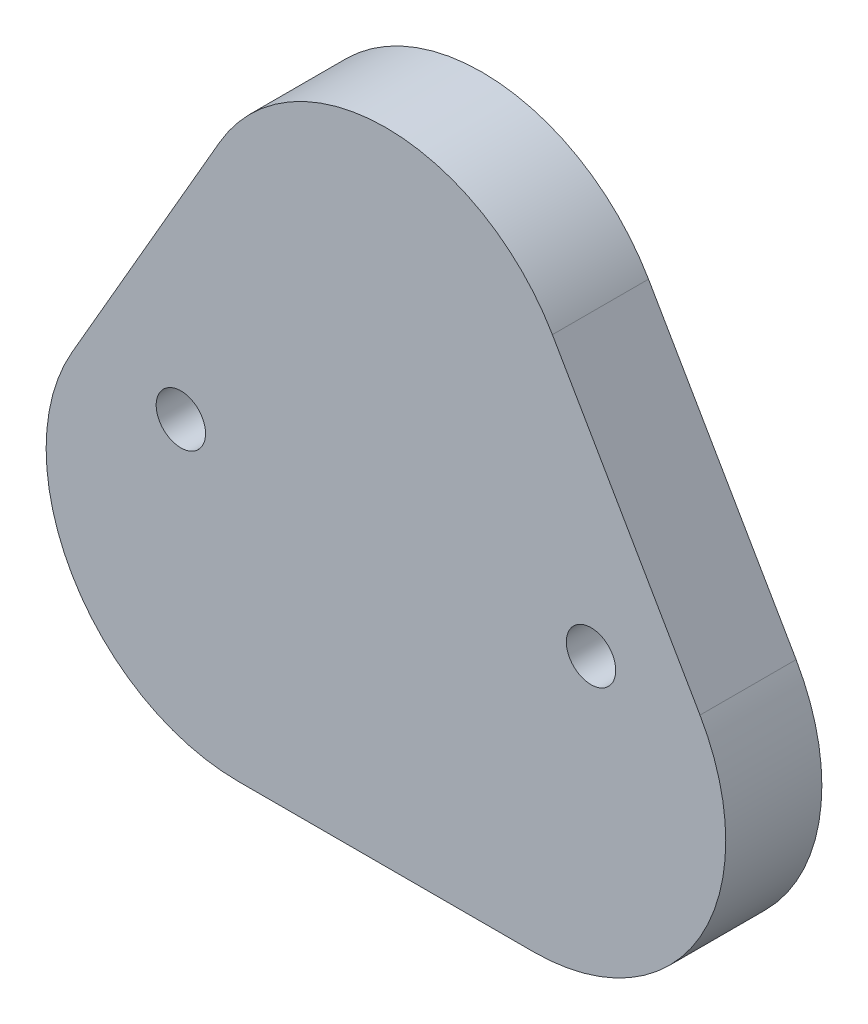
ISO-10303-21;
HEADER;
FILE_DESCRIPTION(('STEP AP214'),'2;1');
FILE_NAME('part.step','',(''),(''),'','','');
FILE_SCHEMA(('AUTOMOTIVE_DESIGN { 1 0 10303 214 1 1 1 1 }'));
ENDSEC;
DATA;
#1=APPLICATION_CONTEXT('core data for automotive mechanical design processes');
#2=APPLICATION_PROTOCOL_DEFINITION('international standard','automotive_design',2000,#1);
#3=PRODUCT_CONTEXT('',#1,'mechanical');
#4=PRODUCT('Part','Part','',(#3));
#5=PRODUCT_RELATED_PRODUCT_CATEGORY('part','',(#4));
#6=PRODUCT_DEFINITION_FORMATION('','',#4);
#7=PRODUCT_DEFINITION_CONTEXT('part definition',#1,'design');
#8=PRODUCT_DEFINITION('design','',#6,#7);
#9=PRODUCT_DEFINITION_SHAPE('','',#8);
#10=(LENGTH_UNIT() NAMED_UNIT(*) SI_UNIT(.MILLI.,.METRE.));
#11=(NAMED_UNIT(*) PLANE_ANGLE_UNIT() SI_UNIT($,.RADIAN.));
#12=(NAMED_UNIT(*) SI_UNIT($,.STERADIAN.) SOLID_ANGLE_UNIT());
#13=UNCERTAINTY_MEASURE_WITH_UNIT(LENGTH_MEASURE(1.E-05),#10,'distance_accuracy_value','');
#14=(GEOMETRIC_REPRESENTATION_CONTEXT(3) GLOBAL_UNCERTAINTY_ASSIGNED_CONTEXT((#13)) GLOBAL_UNIT_ASSIGNED_CONTEXT((#10,
#11,#12)) REPRESENTATION_CONTEXT('',''));
#15=CARTESIAN_POINT('',(0.,0.,0.));
#16=DIRECTION('',(0.,0.,1.));
#17=DIRECTION('',(1.,0.,0.));
#18=AXIS2_PLACEMENT_3D('',#15,#16,#17);
#19=CARTESIAN_POINT('',(32.5884799431344,-15.4273172599205,6.35));
#20=DIRECTION('',(-0.866025403784438,-0.5,0.));
#21=DIRECTION('',(0.5,-0.866025403784438,0.));
#22=AXIS2_PLACEMENT_3D('',#19,#20,#21);
#23=PLANE('',#22);
#24=DIRECTION('',(-0.5,0.866025403784438,0.));
#25=VECTOR('',#24,1.);
#26=CARTESIAN_POINT('',(32.5884799431344,-15.4273172599205,6.35));
#27=LINE('',#26,#25);
#28=CARTESIAN_POINT('',(21.589957315072,3.62268274007955,6.35));
#29=VERTEX_POINT('',#28);
#30=CARTESIAN_POINT('',(11.8370025711967,20.5152958803914,6.35));
#31=VERTEX_POINT('',#30);
#32=EDGE_CURVE('E104',#29,#31,#27,.T.);
#33=ORIENTED_EDGE('',*,*,#32,.F.);
#34=DIRECTION('',(0.,0.,-1.));
#35=VECTOR('',#34,1.);
#36=CARTESIAN_POINT('',(21.589957315072,3.62268274007955,6.35));
#37=LINE('',#36,#35);
#38=CARTESIAN_POINT('',(21.589957315072,3.62268274007955,0.));
#39=VERTEX_POINT('',#38);
#40=EDGE_CURVE('E90',#29,#39,#37,.T.);
#41=ORIENTED_EDGE('',*,*,#40,.T.);
#42=DIRECTION('',(-0.5,0.866025403784438,0.));
#43=VECTOR('',#42,1.);
#44=CARTESIAN_POINT('',(32.5884799431344,-15.4273172599205,0.));
#45=LINE('',#44,#43);
#46=CARTESIAN_POINT('',(11.8370025711967,20.5152958803914,0.));
#47=VERTEX_POINT('',#46);
#48=EDGE_CURVE('E102',#39,#47,#45,.T.);
#49=ORIENTED_EDGE('',*,*,#48,.T.);
#50=DIRECTION('',(0.,0.,-1.));
#51=VECTOR('',#50,1.);
#52=CARTESIAN_POINT('',(11.8370025711967,20.5152958803914,6.35));
#53=LINE('',#52,#51);
#54=EDGE_CURVE('E106',#47,#31,#53,.F.);
#55=ORIENTED_EDGE('',*,*,#54,.T.);
#56=EDGE_LOOP('',(#33,#41,#49,#55));
#57=FACE_BOUND('',#56,.T.);
#58=ADVANCED_FACE('F33',(#57),#23,.F.);
#59=CARTESIAN_POINT('',(0.838479943134358,39.5652958803914,6.35));
#60=DIRECTION('',(0.866025403784439,-0.5,0.));
#61=DIRECTION('',(0.5,0.866025403784439,0.));
#62=AXIS2_PLACEMENT_3D('',#59,#60,#61);
#63=PLANE('',#62);
#64=DIRECTION('',(-0.5,-0.866025403784439,0.));
#65=VECTOR('',#64,1.);
#66=CARTESIAN_POINT('',(0.838479943134358,39.5652958803914,0.));
#67=LINE('',#66,#65);
#68=CARTESIAN_POINT('',(-10.160042684928,20.5152958803914,0.));
#69=VERTEX_POINT('',#68);
#70=CARTESIAN_POINT('',(-19.9129974288033,3.62268274007953,0.));
#71=VERTEX_POINT('',#70);
#72=EDGE_CURVE('E110',#69,#71,#67,.T.);
#73=ORIENTED_EDGE('',*,*,#72,.T.);
#74=DIRECTION('',(0.,0.,-1.));
#75=VECTOR('',#74,1.);
#76=CARTESIAN_POINT('',(-19.9129974288033,3.62268274007955,6.35));
#77=LINE('',#76,#75);
#78=CARTESIAN_POINT('',(-19.9129974288033,3.62268274007953,6.35));
#79=VERTEX_POINT('',#78);
#80=EDGE_CURVE('E11',#71,#79,#77,.F.);
#81=ORIENTED_EDGE('',*,*,#80,.T.);
#82=DIRECTION('',(-0.5,-0.866025403784439,0.));
#83=VECTOR('',#82,1.);
#84=CARTESIAN_POINT('',(0.838479943134358,39.5652958803914,6.35));
#85=LINE('',#84,#83);
#86=CARTESIAN_POINT('',(-10.160042684928,20.5152958803914,6.35));
#87=VERTEX_POINT('',#86);
#88=EDGE_CURVE('E140',#87,#79,#85,.T.);
#89=ORIENTED_EDGE('',*,*,#88,.F.);
#90=DIRECTION('',(0.,0.,-1.));
#91=VECTOR('',#90,1.);
#92=CARTESIAN_POINT('',(-10.160042684928,20.5152958803914,6.35));
#93=LINE('',#92,#91);
#94=EDGE_CURVE('E41',#87,#69,#93,.T.);
#95=ORIENTED_EDGE('',*,*,#94,.T.);
#96=EDGE_LOOP('',(#73,#81,#89,#95));
#97=FACE_BOUND('',#96,.T.);
#98=ADVANCED_FACE('F139',(#97),#63,.F.);
#99=CARTESIAN_POINT('',(-30.9115200568656,-15.4273172599205,6.35));
#100=DIRECTION('',(0.,1.,0.));
#101=DIRECTION('',(0.,0.,1.));
#102=AXIS2_PLACEMENT_3D('',#99,#100,#101);
#103=PLANE('',#102);
#104=DIRECTION('',(1.,0.,0.));
#105=VECTOR('',#104,1.);
#106=CARTESIAN_POINT('',(-30.9115200568656,-15.4273172599205,0.));
#107=LINE('',#106,#105);
#108=CARTESIAN_POINT('',(-8.91447480074089,-15.4273172599205,0.));
#109=VERTEX_POINT('',#108);
#110=CARTESIAN_POINT('',(10.5914346870096,-15.4273172599205,0.));
#111=VERTEX_POINT('',#110);
#112=EDGE_CURVE('E113',#109,#111,#107,.T.);
#113=ORIENTED_EDGE('',*,*,#112,.T.);
#114=DIRECTION('',(0.,0.,-1.));
#115=VECTOR('',#114,1.);
#116=CARTESIAN_POINT('',(10.5914346870096,-15.4273172599205,6.35));
#117=LINE('',#116,#115);
#118=CARTESIAN_POINT('',(10.5914346870096,-15.4273172599205,6.35));
#119=VERTEX_POINT('',#118);
#120=EDGE_CURVE('E91',#111,#119,#117,.F.);
#121=ORIENTED_EDGE('',*,*,#120,.T.);
#122=DIRECTION('',(1.,0.,0.));
#123=VECTOR('',#122,1.);
#124=CARTESIAN_POINT('',(-30.9115200568656,-15.4273172599205,6.35));
#125=LINE('',#124,#123);
#126=CARTESIAN_POINT('',(-8.91447480074089,-15.4273172599205,6.35));
#127=VERTEX_POINT('',#126);
#128=EDGE_CURVE('E119',#127,#119,#125,.T.);
#129=ORIENTED_EDGE('',*,*,#128,.F.);
#130=DIRECTION('',(0.,0.,-1.));
#131=VECTOR('',#130,1.);
#132=CARTESIAN_POINT('',(-8.91447480074089,-15.4273172599205,6.35));
#133=LINE('',#132,#131);
#134=EDGE_CURVE('E96',#127,#109,#133,.T.);
#135=ORIENTED_EDGE('',*,*,#134,.T.);
#136=EDGE_LOOP('',(#113,#121,#129,#135));
#137=FACE_BOUND('',#136,.T.);
#138=ADVANCED_FACE('F148',(#137),#103,.F.);
#139=CARTESIAN_POINT('',(0.,0.,6.35));
#140=DIRECTION('',(0.,0.,1.));
#141=DIRECTION('',(1.,0.,0.));
#142=AXIS2_PLACEMENT_3D('',#139,#140,#141);
#143=PLANE('',#142);
#144=CARTESIAN_POINT('',(-12.7122587428345,3.39472799620424,6.35));
#145=DIRECTION('',(0.,0.,1.));
#146=DIRECTION('',(1.,0.,0.));
#147=AXIS2_PLACEMENT_3D('',#144,#145,#146);
#148=CIRCLE('',#147,1.63194999999999);
#149=CARTESIAN_POINT('',(-11.0803087428345,3.39472799620424,6.35));
#150=VERTEX_POINT('',#149);
#151=EDGE_CURVE('E126',#150,#150,#148,.T.);
#152=ORIENTED_EDGE('',*,*,#151,.F.);
#153=EDGE_LOOP('',(#152));
#154=FACE_BOUND('',#153,.T.);
#155=CARTESIAN_POINT('',(14.3892186291032,3.3947279962043,6.35));
#156=DIRECTION('',(0.,0.,1.));
#157=DIRECTION('',(1.,0.,0.));
#158=AXIS2_PLACEMENT_3D('',#155,#156,#157);
#159=CIRCLE('',#158,1.63194999999999);
#160=CARTESIAN_POINT('',(16.0211686291032,3.3947279962043,6.35));
#161=VERTEX_POINT('',#160);
#162=EDGE_CURVE('E116',#161,#161,#159,.T.);
#163=ORIENTED_EDGE('',*,*,#162,.F.);
#164=EDGE_LOOP('',(#163));
#165=FACE_BOUND('',#164,.T.);
#166=ORIENTED_EDGE('',*,*,#128,.T.);
#167=CARTESIAN_POINT('',(10.5914346870096,-2.72731725992046,6.35));
#168=DIRECTION('',(0.,0.,1.));
#169=DIRECTION('',(1.,0.,0.));
#170=AXIS2_PLACEMENT_3D('',#167,#168,#169);
#171=CIRCLE('',#170,12.7);
#172=EDGE_CURVE('E136',#119,#29,#171,.T.);
#173=ORIENTED_EDGE('',*,*,#172,.T.);
#174=ORIENTED_EDGE('',*,*,#32,.T.);
#175=CARTESIAN_POINT('',(0.838479943134365,14.1652958803914,6.35));
#176=DIRECTION('',(0.,0.,1.));
#177=DIRECTION('',(1.,0.,0.));
#178=AXIS2_PLACEMENT_3D('',#175,#176,#177);
#179=CIRCLE('',#178,12.7);
#180=EDGE_CURVE('E53',#31,#87,#179,.T.);
#181=ORIENTED_EDGE('',*,*,#180,.T.);
#182=ORIENTED_EDGE('',*,*,#88,.T.);
#183=CARTESIAN_POINT('',(-8.91447480074089,-2.72731725992046,6.35));
#184=DIRECTION('',(0.,0.,1.));
#185=DIRECTION('',(1.,0.,0.));
#186=AXIS2_PLACEMENT_3D('',#183,#184,#185);
#187=CIRCLE('',#186,12.7);
#188=EDGE_CURVE('E134',#79,#127,#187,.T.);
#189=ORIENTED_EDGE('',*,*,#188,.T.);
#190=EDGE_LOOP('',(#166,#173,#174,#181,#182,#189));
#191=FACE_BOUND('',#190,.T.);
#192=ADVANCED_FACE('F160',(#154,#165,#191),#143,.T.);
#193=CARTESIAN_POINT('',(0.,0.,0.));
#194=DIRECTION('',(0.,0.,1.));
#195=DIRECTION('',(1.,0.,0.));
#196=AXIS2_PLACEMENT_3D('',#193,#194,#195);
#197=PLANE('',#196);
#198=CARTESIAN_POINT('',(-12.7122587428345,3.39472799620424,0.));
#199=DIRECTION('',(0.,0.,1.));
#200=DIRECTION('',(1.,0.,0.));
#201=AXIS2_PLACEMENT_3D('',#198,#199,#200);
#202=CIRCLE('',#201,1.63194999999999);
#203=CARTESIAN_POINT('',(-11.0803087428345,3.39472799620424,0.));
#204=VERTEX_POINT('',#203);
#205=EDGE_CURVE('E123',#204,#204,#202,.T.);
#206=ORIENTED_EDGE('',*,*,#205,.T.);
#207=EDGE_LOOP('',(#206));
#208=FACE_BOUND('',#207,.T.);
#209=CARTESIAN_POINT('',(14.3892186291032,3.3947279962043,0.));
#210=DIRECTION('',(0.,0.,1.));
#211=DIRECTION('',(1.,0.,0.));
#212=AXIS2_PLACEMENT_3D('',#209,#210,#211);
#213=CIRCLE('',#212,1.63194999999999);
#214=CARTESIAN_POINT('',(16.0211686291032,3.3947279962043,0.));
#215=VERTEX_POINT('',#214);
#216=EDGE_CURVE('E111',#215,#215,#213,.T.);
#217=ORIENTED_EDGE('',*,*,#216,.T.);
#218=EDGE_LOOP('',(#217));
#219=FACE_BOUND('',#218,.T.);
#220=ORIENTED_EDGE('',*,*,#48,.F.);
#221=CARTESIAN_POINT('',(10.5914346870096,-2.72731725992046,0.));
#222=DIRECTION('',(0.,0.,1.));
#223=DIRECTION('',(1.,0.,0.));
#224=AXIS2_PLACEMENT_3D('',#221,#222,#223);
#225=CIRCLE('',#224,12.7);
#226=EDGE_CURVE('E86',#39,#111,#225,.F.);
#227=ORIENTED_EDGE('',*,*,#226,.T.);
#228=ORIENTED_EDGE('',*,*,#112,.F.);
#229=CARTESIAN_POINT('',(-8.91447480074089,-2.72731725992046,0.));
#230=DIRECTION('',(0.,0.,1.));
#231=DIRECTION('',(1.,0.,0.));
#232=AXIS2_PLACEMENT_3D('',#229,#230,#231);
#233=CIRCLE('',#232,12.7);
#234=EDGE_CURVE('E97',#109,#71,#233,.F.);
#235=ORIENTED_EDGE('',*,*,#234,.T.);
#236=ORIENTED_EDGE('',*,*,#72,.F.);
#237=CARTESIAN_POINT('',(0.838479943134365,14.1652958803914,0.));
#238=DIRECTION('',(0.,0.,1.));
#239=DIRECTION('',(1.,0.,0.));
#240=AXIS2_PLACEMENT_3D('',#237,#238,#239);
#241=CIRCLE('',#240,12.7);
#242=EDGE_CURVE('E105',#69,#47,#241,.F.);
#243=ORIENTED_EDGE('',*,*,#242,.T.);
#244=EDGE_LOOP('',(#220,#227,#228,#235,#236,#243));
#245=FACE_BOUND('',#244,.T.);
#246=ADVANCED_FACE('F108',(#208,#219,#245),#197,.F.);
#247=CARTESIAN_POINT('',(14.3892186291032,3.3947279962043,6.35));
#248=DIRECTION('',(0.,0.,1.));
#249=DIRECTION('',(1.,0.,0.));
#250=AXIS2_PLACEMENT_3D('',#247,#248,#249);
#251=CYLINDRICAL_SURFACE('',#250,1.63194999999999);
#252=ORIENTED_EDGE('',*,*,#162,.T.);
#253=EDGE_LOOP('',(#252));
#254=FACE_BOUND('',#253,.T.);
#255=ORIENTED_EDGE('',*,*,#216,.F.);
#256=EDGE_LOOP('',(#255));
#257=FACE_BOUND('',#256,.T.);
#258=ADVANCED_FACE('F166',(#254,#257),#251,.F.);
#259=CARTESIAN_POINT('',(-12.7122587428345,3.39472799620424,6.35));
#260=DIRECTION('',(0.,0.,1.));
#261=DIRECTION('',(1.,0.,0.));
#262=AXIS2_PLACEMENT_3D('',#259,#260,#261);
#263=CYLINDRICAL_SURFACE('',#262,1.63194999999999);
#264=ORIENTED_EDGE('',*,*,#151,.T.);
#265=EDGE_LOOP('',(#264));
#266=FACE_BOUND('',#265,.T.);
#267=ORIENTED_EDGE('',*,*,#205,.F.);
#268=EDGE_LOOP('',(#267));
#269=FACE_BOUND('',#268,.T.);
#270=ADVANCED_FACE('F157',(#266,#269),#263,.F.);
#271=CARTESIAN_POINT('',(10.5914346870096,-2.72731725992046,6.35));
#272=DIRECTION('',(0.,0.,-1.));
#273=DIRECTION('',(-1.,0.,0.));
#274=AXIS2_PLACEMENT_3D('',#271,#272,#273);
#275=CYLINDRICAL_SURFACE('',#274,12.7);
#276=ORIENTED_EDGE('',*,*,#172,.F.);
#277=ORIENTED_EDGE('',*,*,#120,.F.);
#278=ORIENTED_EDGE('',*,*,#226,.F.);
#279=ORIENTED_EDGE('',*,*,#40,.F.);
#280=EDGE_LOOP('',(#276,#277,#278,#279));
#281=FACE_BOUND('',#280,.T.);
#282=ADVANCED_FACE('F89',(#281),#275,.T.);
#283=CARTESIAN_POINT('',(-8.91447480074089,-2.72731725992046,6.35));
#284=DIRECTION('',(0.,0.,-1.));
#285=DIRECTION('',(-1.,0.,0.));
#286=AXIS2_PLACEMENT_3D('',#283,#284,#285);
#287=CYLINDRICAL_SURFACE('',#286,12.7);
#288=ORIENTED_EDGE('',*,*,#188,.F.);
#289=ORIENTED_EDGE('',*,*,#80,.F.);
#290=ORIENTED_EDGE('',*,*,#234,.F.);
#291=ORIENTED_EDGE('',*,*,#134,.F.);
#292=EDGE_LOOP('',(#288,#289,#290,#291));
#293=FACE_BOUND('',#292,.T.);
#294=ADVANCED_FACE('F145',(#293),#287,.T.);
#295=CARTESIAN_POINT('',(0.838479943134365,14.1652958803914,6.35));
#296=DIRECTION('',(0.,0.,-1.));
#297=DIRECTION('',(-1.,0.,0.));
#298=AXIS2_PLACEMENT_3D('',#295,#296,#297);
#299=CYLINDRICAL_SURFACE('',#298,12.7);
#300=ORIENTED_EDGE('',*,*,#180,.F.);
#301=ORIENTED_EDGE('',*,*,#54,.F.);
#302=ORIENTED_EDGE('',*,*,#242,.F.);
#303=ORIENTED_EDGE('',*,*,#94,.F.);
#304=EDGE_LOOP('',(#300,#301,#302,#303));
#305=FACE_BOUND('',#304,.T.);
#306=ADVANCED_FACE('F35',(#305),#299,.T.);
#307=CLOSED_SHELL('',(#58,#98,#138,#192,#246,#258,#270,#282,#294,#306));
#308=MANIFOLD_SOLID_BREP('B2',#307);
#309=ADVANCED_BREP_SHAPE_REPRESENTATION('',(#18,#308),#14);
#310=SHAPE_DEFINITION_REPRESENTATION(#9,#309);
ENDSEC;
END-ISO-10303-21;
